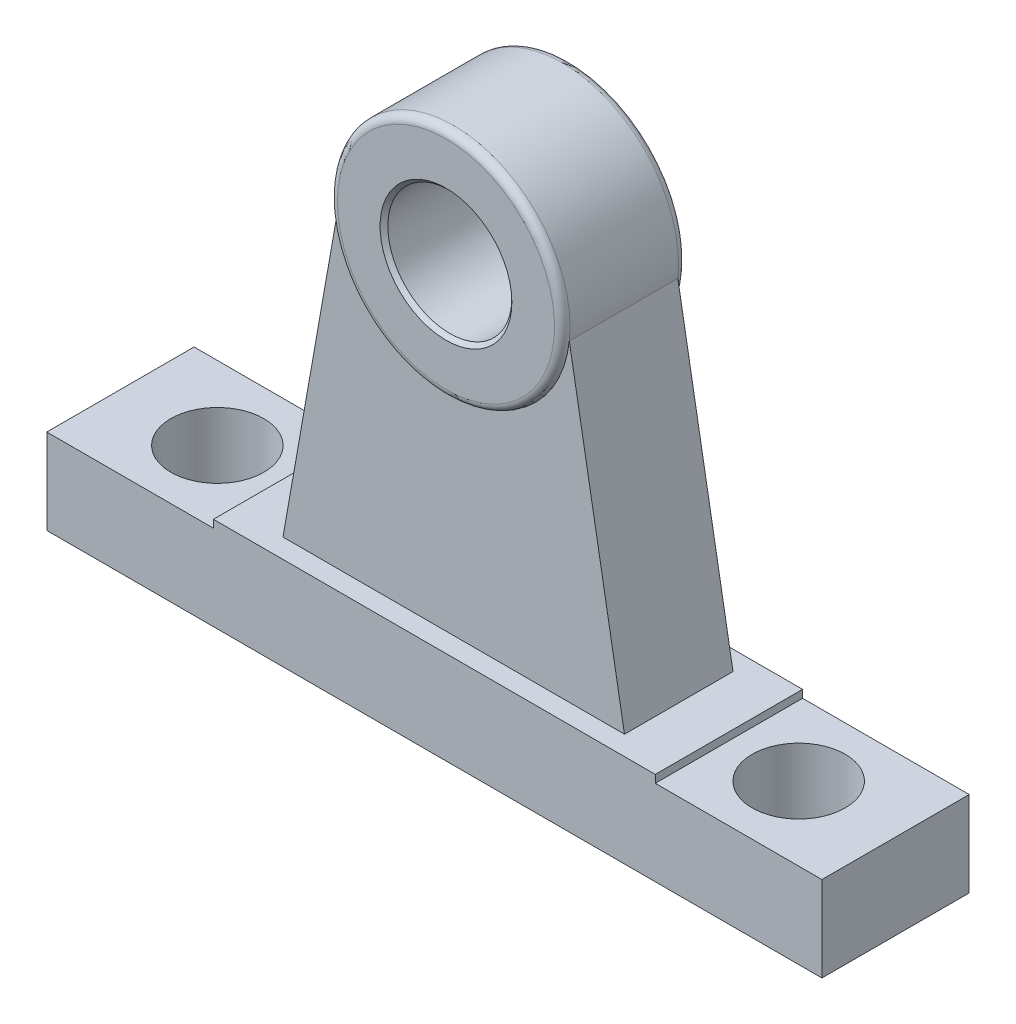
ISO-10303-21;
HEADER;
FILE_DESCRIPTION(('STEP AP214'),'2;1');
FILE_NAME('part.step','',(''),(''),'','','');
FILE_SCHEMA(('AUTOMOTIVE_DESIGN { 1 0 10303 214 1 1 1 1 }'));
ENDSEC;
DATA;
#1=APPLICATION_CONTEXT('core data for automotive mechanical design processes');
#2=APPLICATION_PROTOCOL_DEFINITION('international standard','automotive_design',2000,#1);
#3=PRODUCT_CONTEXT('',#1,'mechanical');
#4=PRODUCT('Part','Part','',(#3));
#5=PRODUCT_RELATED_PRODUCT_CATEGORY('part','',(#4));
#6=PRODUCT_DEFINITION_FORMATION('','',#4);
#7=PRODUCT_DEFINITION_CONTEXT('part definition',#1,'design');
#8=PRODUCT_DEFINITION('design','',#6,#7);
#9=PRODUCT_DEFINITION_SHAPE('','',#8);
#10=(LENGTH_UNIT() NAMED_UNIT(*) SI_UNIT(.MILLI.,.METRE.));
#11=(NAMED_UNIT(*) PLANE_ANGLE_UNIT() SI_UNIT($,.RADIAN.));
#12=(NAMED_UNIT(*) SI_UNIT($,.STERADIAN.) SOLID_ANGLE_UNIT());
#13=UNCERTAINTY_MEASURE_WITH_UNIT(LENGTH_MEASURE(1.E-05),#10,'distance_accuracy_value','');
#14=(GEOMETRIC_REPRESENTATION_CONTEXT(3) GLOBAL_UNCERTAINTY_ASSIGNED_CONTEXT((#13)) GLOBAL_UNIT_ASSIGNED_CONTEXT((#10,
#11,#12)) REPRESENTATION_CONTEXT('',''));
#15=CARTESIAN_POINT('',(0.,0.,0.));
#16=DIRECTION('',(0.,0.,1.));
#17=DIRECTION('',(1.,0.,0.));
#18=AXIS2_PLACEMENT_3D('',#15,#16,#17);
#19=CARTESIAN_POINT('',(0.,54.,-8.));
#20=DIRECTION('',(0.,0.,1.));
#21=DIRECTION('',(1.,0.,0.));
#22=AXIS2_PLACEMENT_3D('',#19,#20,#21);
#23=CYLINDRICAL_SURFACE('',#22,8.);
#24=CARTESIAN_POINT('',(0.,54.,7.5));
#25=DIRECTION('',(0.,0.,1.));
#26=DIRECTION('',(1.,0.,0.));
#27=AXIS2_PLACEMENT_3D('',#24,#25,#26);
#28=CIRCLE('',#27,8.);
#29=CARTESIAN_POINT('',(8.,54.,7.5));
#30=VERTEX_POINT('',#29);
#31=EDGE_CURVE('E483',#30,#30,#28,.T.);
#32=ORIENTED_EDGE('',*,*,#31,.T.);
#33=EDGE_LOOP('',(#32));
#34=FACE_BOUND('',#33,.T.);
#35=CARTESIAN_POINT('',(0.,54.,-7.5));
#36=DIRECTION('',(0.,0.,-1.));
#37=DIRECTION('',(-1.,0.,0.));
#38=AXIS2_PLACEMENT_3D('',#35,#36,#37);
#39=CIRCLE('',#38,8.);
#40=CARTESIAN_POINT('',(-8.,54.,-7.5));
#41=VERTEX_POINT('',#40);
#42=EDGE_CURVE('E502',#41,#41,#39,.T.);
#43=ORIENTED_EDGE('',*,*,#42,.T.);
#44=EDGE_LOOP('',(#43));
#45=FACE_BOUND('',#44,.T.);
#46=ADVANCED_FACE('F16',(#34,#45),#23,.F.);
#47=CARTESIAN_POINT('',(0.,54.,-8.));
#48=DIRECTION('',(0.,0.,-1.));
#49=DIRECTION('',(0.,1.,0.));
#50=AXIS2_PLACEMENT_3D('',#47,#48,#49);
#51=CONICAL_SURFACE('',#50,8.5,0.785398163397447);
#52=ORIENTED_EDGE('',*,*,#42,.F.);
#53=EDGE_LOOP('',(#52));
#54=FACE_BOUND('',#53,.T.);
#55=CARTESIAN_POINT('',(0.,54.,-8.));
#56=DIRECTION('',(0.,0.,-1.));
#57=DIRECTION('',(0.,1.,0.));
#58=AXIS2_PLACEMENT_3D('',#55,#56,#57);
#59=CIRCLE('',#58,8.5);
#60=CARTESIAN_POINT('',(0.,62.5,-8.));
#61=VERTEX_POINT('',#60);
#62=EDGE_CURVE('E19',#61,#61,#59,.T.);
#63=ORIENTED_EDGE('',*,*,#62,.T.);
#64=EDGE_LOOP('',(#63));
#65=FACE_BOUND('',#64,.T.);
#66=ADVANCED_FACE('F221',(#54,#65),#51,.F.);
#67=CARTESIAN_POINT('',(0.,54.,8.));
#68=DIRECTION('',(0.,0.,1.));
#69=DIRECTION('',(1.,0.,0.));
#70=AXIS2_PLACEMENT_3D('',#67,#68,#69);
#71=CONICAL_SURFACE('',#70,8.5,0.78539816339745);
#72=CARTESIAN_POINT('',(0.,54.,8.));
#73=DIRECTION('',(0.,0.,1.));
#74=DIRECTION('',(1.,0.,0.));
#75=AXIS2_PLACEMENT_3D('',#72,#73,#74);
#76=CIRCLE('',#75,8.5);
#77=CARTESIAN_POINT('',(8.5,54.,8.));
#78=VERTEX_POINT('',#77);
#79=EDGE_CURVE('E469',#78,#78,#76,.T.);
#80=ORIENTED_EDGE('',*,*,#79,.T.);
#81=EDGE_LOOP('',(#80));
#82=FACE_BOUND('',#81,.T.);
#83=ORIENTED_EDGE('',*,*,#31,.F.);
#84=EDGE_LOOP('',(#83));
#85=FACE_BOUND('',#84,.T.);
#86=ADVANCED_FACE('F218',(#82,#85),#71,.F.);
#87=CARTESIAN_POINT('',(-14.,54.,-8.));
#88=DIRECTION('',(0.,0.,1.));
#89=DIRECTION('',(1.,0.,0.));
#90=AXIS2_PLACEMENT_3D('',#87,#88,#89);
#91=PLANE('',#90);
#92=CARTESIAN_POINT('',(0.,54.,-8.));
#93=DIRECTION('',(0.,0.,1.));
#94=DIRECTION('',(-1.,0.,0.));
#95=AXIS2_PLACEMENT_3D('',#92,#93,#94);
#96=CIRCLE('',#95,14.);
#97=CARTESIAN_POINT('',(-14.,54.,-8.));
#98=VERTEX_POINT('',#97);
#99=EDGE_CURVE('E202',#98,#98,#96,.T.);
#100=ORIENTED_EDGE('',*,*,#99,.F.);
#101=EDGE_LOOP('',(#100));
#102=FACE_BOUND('',#101,.T.);
#103=ORIENTED_EDGE('',*,*,#62,.F.);
#104=EDGE_LOOP('',(#103));
#105=FACE_BOUND('',#104,.T.);
#106=ADVANCED_FACE('F208',(#102,#105),#91,.F.);
#107=CARTESIAN_POINT('',(0.,54.,8.));
#108=DIRECTION('',(0.,0.,-1.));
#109=DIRECTION('',(-1.,0.,0.));
#110=AXIS2_PLACEMENT_3D('',#107,#108,#109);
#111=PLANE('',#110);
#112=ORIENTED_EDGE('',*,*,#79,.F.);
#113=EDGE_LOOP('',(#112));
#114=FACE_BOUND('',#113,.T.);
#115=CARTESIAN_POINT('',(0.,54.,8.));
#116=DIRECTION('',(0.,0.,-1.));
#117=DIRECTION('',(-1.,0.,0.));
#118=AXIS2_PLACEMENT_3D('',#115,#116,#117);
#119=CIRCLE('',#118,14.);
#120=CARTESIAN_POINT('',(-14.,54.,8.));
#121=VERTEX_POINT('',#120);
#122=EDGE_CURVE('E132',#121,#121,#119,.T.);
#123=ORIENTED_EDGE('',*,*,#122,.F.);
#124=EDGE_LOOP('',(#123));
#125=FACE_BOUND('',#124,.T.);
#126=ADVANCED_FACE('F217',(#114,#125),#111,.F.);
#127=CARTESIAN_POINT('',(0.,54.,-7.));
#128=DIRECTION('',(0.,0.,-1.));
#129=DIRECTION('',(-1.,0.,0.));
#130=AXIS2_PLACEMENT_3D('',#127,#128,#129);
#131=TOROIDAL_SURFACE('',#130,14.,0.999999999999997);
#132=ORIENTED_EDGE('',*,*,#99,.T.);
#133=EDGE_LOOP('',(#132));
#134=FACE_BOUND('',#133,.T.);
#135=CARTESIAN_POINT('',(0.,54.,-7.));
#136=DIRECTION('',(0.,0.,-1.));
#137=DIRECTION('',(-1.,0.,0.));
#138=AXIS2_PLACEMENT_3D('',#135,#136,#137);
#139=CIRCLE('',#138,15.);
#140=CARTESIAN_POINT('',(14.9105539895769,52.3643411957526,-7.00000000000001));
#141=VERTEX_POINT('',#140);
#142=CARTESIAN_POINT('',(-14.9105539895769,52.3643411957525,-7.));
#143=VERTEX_POINT('',#142);
#144=EDGE_CURVE('E104',#141,#143,#139,.T.);
#145=ORIENTED_EDGE('',*,*,#144,.T.);
#146=CARTESIAN_POINT('',(0.,54.,-7.));
#147=DIRECTION('',(0.,0.,1.));
#148=DIRECTION('',(1.,0.,0.));
#149=AXIS2_PLACEMENT_3D('',#146,#147,#148);
#150=CIRCLE('',#149,15.);
#151=EDGE_CURVE('E128',#141,#143,#150,.T.);
#152=ORIENTED_EDGE('',*,*,#151,.F.);
#153=EDGE_LOOP('',(#145,#152));
#154=FACE_BOUND('',#153,.T.);
#155=ADVANCED_FACE('F129',(#134,#154),#131,.T.);
#156=CARTESIAN_POINT('',(0.,54.,7.));
#157=DIRECTION('',(0.,0.,-1.));
#158=DIRECTION('',(-1.,0.,0.));
#159=AXIS2_PLACEMENT_3D('',#156,#157,#158);
#160=TOROIDAL_SURFACE('',#159,14.,0.999999999999997);
#161=CARTESIAN_POINT('',(0.,54.,7.));
#162=DIRECTION('',(0.,0.,-1.));
#163=DIRECTION('',(-1.,0.,0.));
#164=AXIS2_PLACEMENT_3D('',#161,#162,#163);
#165=CIRCLE('',#164,15.);
#166=CARTESIAN_POINT('',(14.9105539895769,52.3643411957526,7.));
#167=VERTEX_POINT('',#166);
#168=CARTESIAN_POINT('',(-14.9105539895769,52.3643411957525,7.));
#169=VERTEX_POINT('',#168);
#170=EDGE_CURVE('E167',#167,#169,#165,.T.);
#171=ORIENTED_EDGE('',*,*,#170,.F.);
#172=CARTESIAN_POINT('',(0.,54.,7.));
#173=DIRECTION('',(0.,0.,1.));
#174=DIRECTION('',(1.,0.,0.));
#175=AXIS2_PLACEMENT_3D('',#172,#173,#174);
#176=CIRCLE('',#175,15.);
#177=EDGE_CURVE('E114',#169,#167,#176,.F.);
#178=ORIENTED_EDGE('',*,*,#177,.F.);
#179=EDGE_LOOP('',(#171,#178));
#180=FACE_BOUND('',#179,.T.);
#181=ORIENTED_EDGE('',*,*,#122,.T.);
#182=EDGE_LOOP('',(#181));
#183=FACE_BOUND('',#182,.T.);
#184=ADVANCED_FACE('F176',(#180,#183),#160,.T.);
#185=CARTESIAN_POINT('',(0.,54.,-8.));
#186=DIRECTION('',(0.,0.,1.));
#187=DIRECTION('',(1.,0.,0.));
#188=AXIS2_PLACEMENT_3D('',#185,#186,#187);
#189=CYLINDRICAL_SURFACE('',#188,15.);
#190=ORIENTED_EDGE('',*,*,#177,.T.);
#191=DIRECTION('',(0.,0.,1.));
#192=VECTOR('',#191,1.);
#193=CARTESIAN_POINT('',(14.910553989577,52.3643411957525,7.));
#194=LINE('',#193,#192);
#195=EDGE_CURVE('E120',#167,#141,#194,.F.);
#196=ORIENTED_EDGE('',*,*,#195,.T.);
#197=ORIENTED_EDGE('',*,*,#151,.T.);
#198=DIRECTION('',(0.,0.,1.));
#199=VECTOR('',#198,1.);
#200=CARTESIAN_POINT('',(-14.9105539895769,52.3643411957525,7.));
#201=LINE('',#200,#199);
#202=EDGE_CURVE('E165',#143,#169,#201,.T.);
#203=ORIENTED_EDGE('',*,*,#202,.T.);
#204=EDGE_LOOP('',(#190,#196,#197,#203));
#205=FACE_BOUND('',#204,.T.);
#206=ADVANCED_FACE('F134',(#205),#189,.T.);
#207=CARTESIAN_POINT('',(0.,54.0000000000001,-7.));
#208=DIRECTION('',(0.,0.,1.));
#209=DIRECTION('',(1.,0.,0.));
#210=AXIS2_PLACEMENT_3D('',#207,#208,#209);
#211=PLANE('',#210);
#212=ORIENTED_EDGE('',*,*,#144,.F.);
#213=DIRECTION('',(0.17364817766693,-0.984807753012208,0.));
#214=VECTOR('',#213,1.);
#215=CARTESIAN_POINT('',(22.0278764009103,12.,-7.00000000000001));
#216=LINE('',#215,#214);
#217=CARTESIAN_POINT('',(22.0278764009103,12.,-7.));
#218=VERTEX_POINT('',#217);
#219=EDGE_CURVE('E108',#141,#218,#216,.T.);
#220=ORIENTED_EDGE('',*,*,#219,.T.);
#221=DIRECTION('',(1.,0.,0.));
#222=VECTOR('',#221,1.);
#223=CARTESIAN_POINT('',(28.5,12.,-7.));
#224=LINE('',#223,#222);
#225=CARTESIAN_POINT('',(-22.0278764009103,12.,-7.));
#226=VERTEX_POINT('',#225);
#227=EDGE_CURVE('E160',#218,#226,#224,.F.);
#228=ORIENTED_EDGE('',*,*,#227,.T.);
#229=DIRECTION('',(0.17364817766693,0.984807753012208,0.));
#230=VECTOR('',#229,1.);
#231=CARTESIAN_POINT('',(-14.1812316433758,56.5005337584038,-7.00000000000001));
#232=LINE('',#231,#230);
#233=EDGE_CURVE('E110',#226,#143,#232,.T.);
#234=ORIENTED_EDGE('',*,*,#233,.T.);
#235=EDGE_LOOP('',(#212,#220,#228,#234));
#236=FACE_BOUND('',#235,.T.);
#237=ADVANCED_FACE('F106',(#236),#211,.F.);
#238=CARTESIAN_POINT('',(-14.1812316433758,56.5005337584038,7.));
#239=DIRECTION('',(0.984807753012208,-0.17364817766693,0.));
#240=DIRECTION('',(0.17364817766693,0.984807753012208,0.));
#241=AXIS2_PLACEMENT_3D('',#238,#239,#240);
#242=PLANE('',#241);
#243=ORIENTED_EDGE('',*,*,#233,.F.);
#244=DIRECTION('',(0.,0.,-1.));
#245=VECTOR('',#244,1.);
#246=CARTESIAN_POINT('',(-22.0278764009103,12.,-9.5));
#247=LINE('',#246,#245);
#248=CARTESIAN_POINT('',(-22.0278764009102,12.,7.));
#249=VERTEX_POINT('',#248);
#250=EDGE_CURVE('E155',#226,#249,#247,.F.);
#251=ORIENTED_EDGE('',*,*,#250,.T.);
#252=DIRECTION('',(-0.173648177666929,-0.984807753012208,0.));
#253=VECTOR('',#252,1.);
#254=CARTESIAN_POINT('',(-14.9105539895769,52.3643411957525,7.));
#255=LINE('',#254,#253);
#256=EDGE_CURVE('E125',#169,#249,#255,.T.);
#257=ORIENTED_EDGE('',*,*,#256,.F.);
#258=ORIENTED_EDGE('',*,*,#202,.F.);
#259=EDGE_LOOP('',(#243,#251,#257,#258));
#260=FACE_BOUND('',#259,.T.);
#261=ADVANCED_FACE('F297',(#260),#242,.F.);
#262=CARTESIAN_POINT('',(0.,54.0000000000001,7.));
#263=DIRECTION('',(0.,0.,1.));
#264=DIRECTION('',(1.,0.,0.));
#265=AXIS2_PLACEMENT_3D('',#262,#263,#264);
#266=PLANE('',#265);
#267=ORIENTED_EDGE('',*,*,#256,.T.);
#268=DIRECTION('',(1.,0.,0.));
#269=VECTOR('',#268,1.);
#270=CARTESIAN_POINT('',(28.5,12.,7.));
#271=LINE('',#270,#269);
#272=CARTESIAN_POINT('',(22.0278764009103,12.,7.));
#273=VERTEX_POINT('',#272);
#274=EDGE_CURVE('E150',#249,#273,#271,.T.);
#275=ORIENTED_EDGE('',*,*,#274,.T.);
#276=DIRECTION('',(0.17364817766693,-0.984807753012208,0.));
#277=VECTOR('',#276,1.);
#278=CARTESIAN_POINT('',(22.0278764009103,12.,7.));
#279=LINE('',#278,#277);
#280=EDGE_CURVE('E124',#273,#167,#279,.F.);
#281=ORIENTED_EDGE('',*,*,#280,.T.);
#282=ORIENTED_EDGE('',*,*,#170,.T.);
#283=EDGE_LOOP('',(#267,#275,#281,#282));
#284=FACE_BOUND('',#283,.T.);
#285=ADVANCED_FACE('F294',(#284),#266,.T.);
#286=CARTESIAN_POINT('',(22.0278764009103,12.,7.));
#287=DIRECTION('',(-0.984807753012208,-0.17364817766693,0.));
#288=DIRECTION('',(0.17364817766693,-0.984807753012208,0.));
#289=AXIS2_PLACEMENT_3D('',#286,#287,#288);
#290=PLANE('',#289);
#291=ORIENTED_EDGE('',*,*,#280,.F.);
#292=DIRECTION('',(0.,0.,-1.));
#293=VECTOR('',#292,1.);
#294=CARTESIAN_POINT('',(22.0278764009103,12.,-9.5));
#295=LINE('',#294,#293);
#296=EDGE_CURVE('E123',#273,#218,#295,.T.);
#297=ORIENTED_EDGE('',*,*,#296,.T.);
#298=ORIENTED_EDGE('',*,*,#219,.F.);
#299=ORIENTED_EDGE('',*,*,#195,.F.);
#300=EDGE_LOOP('',(#291,#297,#298,#299));
#301=FACE_BOUND('',#300,.T.);
#302=ADVANCED_FACE('F118',(#301),#290,.F.);
#303=CARTESIAN_POINT('',(-28.5,0.,0.));
#304=DIRECTION('',(1.,0.,0.));
#305=DIRECTION('',(0.,0.,-1.));
#306=AXIS2_PLACEMENT_3D('',#303,#304,#305);
#307=PLANE('',#306);
#308=DIRECTION('',(0.,1.,0.));
#309=VECTOR('',#308,1.);
#310=CARTESIAN_POINT('',(-28.5,0.,9.5));
#311=LINE('',#310,#309);
#312=CARTESIAN_POINT('',(-28.5,12.,9.5));
#313=VERTEX_POINT('',#312);
#314=CARTESIAN_POINT('',(-28.5,11.,9.5));
#315=VERTEX_POINT('',#314);
#316=EDGE_CURVE('E138',#313,#315,#311,.F.);
#317=ORIENTED_EDGE('',*,*,#316,.F.);
#318=DIRECTION('',(0.,0.,-1.));
#319=VECTOR('',#318,1.);
#320=CARTESIAN_POINT('',(-28.5,12.,-9.5));
#321=LINE('',#320,#319);
#322=CARTESIAN_POINT('',(-28.5,12.,-9.5));
#323=VERTEX_POINT('',#322);
#324=EDGE_CURVE('E566',#313,#323,#321,.T.);
#325=ORIENTED_EDGE('',*,*,#324,.T.);
#326=DIRECTION('',(0.,1.,0.));
#327=VECTOR('',#326,1.);
#328=CARTESIAN_POINT('',(-28.5,0.,-9.5));
#329=LINE('',#328,#327);
#330=CARTESIAN_POINT('',(-28.5,11.,-9.5));
#331=VERTEX_POINT('',#330);
#332=EDGE_CURVE('E136',#331,#323,#329,.T.);
#333=ORIENTED_EDGE('',*,*,#332,.F.);
#334=DIRECTION('',(0.,0.,1.));
#335=VECTOR('',#334,1.);
#336=CARTESIAN_POINT('',(-28.5,11.,0.));
#337=LINE('',#336,#335);
#338=EDGE_CURVE('E162',#315,#331,#337,.F.);
#339=ORIENTED_EDGE('',*,*,#338,.F.);
#340=EDGE_LOOP('',(#317,#325,#333,#339));
#341=FACE_BOUND('',#340,.T.);
#342=ADVANCED_FACE('F287',(#341),#307,.F.);
#343=CARTESIAN_POINT('',(28.5,0.,0.));
#344=DIRECTION('',(1.,0.,0.));
#345=DIRECTION('',(0.,0.,-1.));
#346=AXIS2_PLACEMENT_3D('',#343,#344,#345);
#347=PLANE('',#346);
#348=DIRECTION('',(0.,1.,0.));
#349=VECTOR('',#348,1.);
#350=CARTESIAN_POINT('',(28.5,0.,-9.5));
#351=LINE('',#350,#349);
#352=CARTESIAN_POINT('',(28.5,11.,-9.5));
#353=VERTEX_POINT('',#352);
#354=CARTESIAN_POINT('',(28.5,12.,-9.5));
#355=VERTEX_POINT('',#354);
#356=EDGE_CURVE('E573',#353,#355,#351,.T.);
#357=ORIENTED_EDGE('',*,*,#356,.T.);
#358=DIRECTION('',(0.,0.,-1.));
#359=VECTOR('',#358,1.);
#360=CARTESIAN_POINT('',(28.5,12.,-9.5));
#361=LINE('',#360,#359);
#362=CARTESIAN_POINT('',(28.5,12.,9.5));
#363=VERTEX_POINT('',#362);
#364=EDGE_CURVE('E149',#355,#363,#361,.F.);
#365=ORIENTED_EDGE('',*,*,#364,.T.);
#366=DIRECTION('',(0.,1.,0.));
#367=VECTOR('',#366,1.);
#368=CARTESIAN_POINT('',(28.5,0.,9.5));
#369=LINE('',#368,#367);
#370=CARTESIAN_POINT('',(28.5,11.,9.5));
#371=VERTEX_POINT('',#370);
#372=EDGE_CURVE('E575',#363,#371,#369,.F.);
#373=ORIENTED_EDGE('',*,*,#372,.T.);
#374=DIRECTION('',(0.,0.,1.));
#375=VECTOR('',#374,1.);
#376=CARTESIAN_POINT('',(28.5,11.,0.));
#377=LINE('',#376,#375);
#378=EDGE_CURVE('E491',#353,#371,#377,.T.);
#379=ORIENTED_EDGE('',*,*,#378,.F.);
#380=EDGE_LOOP('',(#357,#365,#373,#379));
#381=FACE_BOUND('',#380,.T.);
#382=ADVANCED_FACE('F283',(#381),#347,.T.);
#383=CARTESIAN_POINT('',(37.5,11.,0.));
#384=DIRECTION('',(0.,-1.,0.));
#385=DIRECTION('',(0.,0.,-1.));
#386=AXIS2_PLACEMENT_3D('',#383,#384,#385);
#387=CYLINDRICAL_SURFACE('',#386,6.);
#388=CARTESIAN_POINT('',(37.5,0.50000000004502,0.));
#389=DIRECTION('',(0.,-1.,0.));
#390=DIRECTION('',(0.,0.,-1.));
#391=AXIS2_PLACEMENT_3D('',#388,#389,#390);
#392=CIRCLE('',#391,5.99999999997181);
#393=CARTESIAN_POINT('',(37.5,0.50000000004502,-5.99999999997181));
#394=VERTEX_POINT('',#393);
#395=EDGE_CURVE('E494',#394,#394,#392,.T.);
#396=ORIENTED_EDGE('',*,*,#395,.T.);
#397=EDGE_LOOP('',(#396));
#398=FACE_BOUND('',#397,.T.);
#399=CARTESIAN_POINT('',(37.5,11.,0.));
#400=DIRECTION('',(0.,-1.,0.));
#401=DIRECTION('',(0.,0.,-1.));
#402=AXIS2_PLACEMENT_3D('',#399,#400,#401);
#403=CIRCLE('',#402,6.);
#404=CARTESIAN_POINT('',(37.5,11.,-6.));
#405=VERTEX_POINT('',#404);
#406=EDGE_CURVE('E487',#405,#405,#403,.T.);
#407=ORIENTED_EDGE('',*,*,#406,.F.);
#408=EDGE_LOOP('',(#407));
#409=FACE_BOUND('',#408,.T.);
#410=ADVANCED_FACE('F279',(#398,#409),#387,.F.);
#411=CARTESIAN_POINT('',(0.,11.,0.));
#412=DIRECTION('',(0.,1.,0.));
#413=DIRECTION('',(0.,0.,1.));
#414=AXIS2_PLACEMENT_3D('',#411,#412,#413);
#415=PLANE('',#414);
#416=CARTESIAN_POINT('',(-37.5,11.,0.));
#417=DIRECTION('',(0.,-1.,0.));
#418=DIRECTION('',(0.,0.,-1.));
#419=AXIS2_PLACEMENT_3D('',#416,#417,#418);
#420=CIRCLE('',#419,6.00000000000001);
#421=CARTESIAN_POINT('',(-37.5,11.,-6.00000000000001));
#422=VERTEX_POINT('',#421);
#423=EDGE_CURVE('E490',#422,#422,#420,.T.);
#424=ORIENTED_EDGE('',*,*,#423,.T.);
#425=EDGE_LOOP('',(#424));
#426=FACE_BOUND('',#425,.T.);
#427=DIRECTION('',(1.,0.,0.));
#428=VECTOR('',#427,1.);
#429=CARTESIAN_POINT('',(50.,11.,-9.5));
#430=LINE('',#429,#428);
#431=CARTESIAN_POINT('',(-50.,11.,-9.5));
#432=VERTEX_POINT('',#431);
#433=EDGE_CURVE('E552',#331,#432,#430,.F.);
#434=ORIENTED_EDGE('',*,*,#433,.T.);
#435=DIRECTION('',(0.,0.,-1.));
#436=VECTOR('',#435,1.);
#437=CARTESIAN_POINT('',(-50.,11.,-9.5));
#438=LINE('',#437,#436);
#439=CARTESIAN_POINT('',(-50.,11.,9.5));
#440=VERTEX_POINT('',#439);
#441=EDGE_CURVE('E547',#432,#440,#438,.F.);
#442=ORIENTED_EDGE('',*,*,#441,.T.);
#443=DIRECTION('',(-1.,0.,0.));
#444=VECTOR('',#443,1.);
#445=CARTESIAN_POINT('',(-50.,11.,9.5));
#446=LINE('',#445,#444);
#447=EDGE_CURVE('E541',#440,#315,#446,.F.);
#448=ORIENTED_EDGE('',*,*,#447,.T.);
#449=ORIENTED_EDGE('',*,*,#338,.T.);
#450=EDGE_LOOP('',(#434,#442,#448,#449));
#451=FACE_BOUND('',#450,.T.);
#452=ADVANCED_FACE('F275',(#426,#451),#415,.T.);
#453=CARTESIAN_POINT('',(28.5,12.,-9.5));
#454=DIRECTION('',(0.,-1.,0.));
#455=DIRECTION('',(0.,0.,-1.));
#456=AXIS2_PLACEMENT_3D('',#453,#454,#455);
#457=PLANE('',#456);
#458=DIRECTION('',(-1.,0.,0.));
#459=VECTOR('',#458,1.);
#460=CARTESIAN_POINT('',(-50.,12.,9.5));
#461=LINE('',#460,#459);
#462=EDGE_CURVE('E538',#313,#363,#461,.F.);
#463=ORIENTED_EDGE('',*,*,#462,.T.);
#464=ORIENTED_EDGE('',*,*,#364,.F.);
#465=DIRECTION('',(1.,0.,0.));
#466=VECTOR('',#465,1.);
#467=CARTESIAN_POINT('',(50.,12.,-9.5));
#468=LINE('',#467,#466);
#469=EDGE_CURVE('E554',#355,#323,#468,.F.);
#470=ORIENTED_EDGE('',*,*,#469,.T.);
#471=ORIENTED_EDGE('',*,*,#324,.F.);
#472=EDGE_LOOP('',(#463,#464,#470,#471));
#473=FACE_BOUND('',#472,.T.);
#474=ORIENTED_EDGE('',*,*,#274,.F.);
#475=ORIENTED_EDGE('',*,*,#250,.F.);
#476=ORIENTED_EDGE('',*,*,#227,.F.);
#477=ORIENTED_EDGE('',*,*,#296,.F.);
#478=EDGE_LOOP('',(#474,#475,#476,#477));
#479=FACE_BOUND('',#478,.T.);
#480=ADVANCED_FACE('F271',(#473,#479),#457,.F.);
#481=CARTESIAN_POINT('',(0.,11.,0.));
#482=DIRECTION('',(0.,1.,0.));
#483=DIRECTION('',(0.,0.,1.));
#484=AXIS2_PLACEMENT_3D('',#481,#482,#483);
#485=PLANE('',#484);
#486=ORIENTED_EDGE('',*,*,#406,.T.);
#487=EDGE_LOOP('',(#486));
#488=FACE_BOUND('',#487,.T.);
#489=DIRECTION('',(0.,0.,1.));
#490=VECTOR('',#489,1.);
#491=CARTESIAN_POINT('',(50.,11.,9.5));
#492=LINE('',#491,#490);
#493=CARTESIAN_POINT('',(50.,11.,9.5));
#494=VERTEX_POINT('',#493);
#495=CARTESIAN_POINT('',(50.,11.,-9.5));
#496=VERTEX_POINT('',#495);
#497=EDGE_CURVE('E527',#494,#496,#492,.F.);
#498=ORIENTED_EDGE('',*,*,#497,.T.);
#499=DIRECTION('',(1.,0.,0.));
#500=VECTOR('',#499,1.);
#501=CARTESIAN_POINT('',(50.,11.,-9.5));
#502=LINE('',#501,#500);
#503=EDGE_CURVE('E557',#496,#353,#502,.F.);
#504=ORIENTED_EDGE('',*,*,#503,.T.);
#505=ORIENTED_EDGE('',*,*,#378,.T.);
#506=DIRECTION('',(-1.,0.,0.));
#507=VECTOR('',#506,1.);
#508=CARTESIAN_POINT('',(-50.,11.,9.5));
#509=LINE('',#508,#507);
#510=EDGE_CURVE('E536',#371,#494,#509,.F.);
#511=ORIENTED_EDGE('',*,*,#510,.T.);
#512=EDGE_LOOP('',(#498,#504,#505,#511));
#513=FACE_BOUND('',#512,.T.);
#514=ADVANCED_FACE('F267',(#488,#513),#485,.T.);
#515=CARTESIAN_POINT('',(-37.5,11.,0.));
#516=DIRECTION('',(0.,-1.,0.));
#517=DIRECTION('',(0.,0.,-1.));
#518=AXIS2_PLACEMENT_3D('',#515,#516,#517);
#519=CYLINDRICAL_SURFACE('',#518,6.00000000000001);
#520=CARTESIAN_POINT('',(-37.5,0.499999999931333,0.));
#521=DIRECTION('',(0.,-1.,0.));
#522=DIRECTION('',(0.,0.,-1.));
#523=AXIS2_PLACEMENT_3D('',#520,#521,#522);
#524=CIRCLE('',#523,6.00000000002865);
#525=CARTESIAN_POINT('',(-37.5,0.499999999931333,-6.00000000002865));
#526=VERTEX_POINT('',#525);
#527=EDGE_CURVE('E498',#526,#526,#524,.T.);
#528=ORIENTED_EDGE('',*,*,#527,.T.);
#529=EDGE_LOOP('',(#528));
#530=FACE_BOUND('',#529,.T.);
#531=ORIENTED_EDGE('',*,*,#423,.F.);
#532=EDGE_LOOP('',(#531));
#533=FACE_BOUND('',#532,.T.);
#534=ADVANCED_FACE('F263',(#530,#533),#519,.F.);
#535=CARTESIAN_POINT('',(37.5,5.6843418860808E-11,0.));
#536=DIRECTION('',(0.,-1.,0.));
#537=DIRECTION('',(0.,0.,-1.));
#538=AXIS2_PLACEMENT_3D('',#535,#536,#537);
#539=CONICAL_SURFACE('',#538,6.49999999995998,0.785398163397448);
#540=CARTESIAN_POINT('',(37.5,5.6843418860808E-11,0.));
#541=DIRECTION('',(0.,-1.,0.));
#542=DIRECTION('',(0.,0.,-1.));
#543=AXIS2_PLACEMENT_3D('',#540,#541,#542);
#544=CIRCLE('',#543,6.49999999995998);
#545=CARTESIAN_POINT('',(37.5,5.6843418860808E-11,-6.49999999995998));
#546=VERTEX_POINT('',#545);
#547=EDGE_CURVE('E495',#546,#546,#544,.T.);
#548=ORIENTED_EDGE('',*,*,#547,.T.);
#549=EDGE_LOOP('',(#548));
#550=FACE_BOUND('',#549,.T.);
#551=ORIENTED_EDGE('',*,*,#395,.F.);
#552=EDGE_LOOP('',(#551));
#553=FACE_BOUND('',#552,.T.);
#554=ADVANCED_FACE('F259',(#550,#553),#539,.F.);
#555=CARTESIAN_POINT('',(50.,11.,-9.5));
#556=DIRECTION('',(0.,0.,1.));
#557=DIRECTION('',(1.,0.,0.));
#558=AXIS2_PLACEMENT_3D('',#555,#556,#557);
#559=PLANE('',#558);
#560=DIRECTION('',(0.,1.,0.));
#561=VECTOR('',#560,1.);
#562=CARTESIAN_POINT('',(-50.,11.,-9.5));
#563=LINE('',#562,#561);
#564=CARTESIAN_POINT('',(-50.,0.,-9.5));
#565=VERTEX_POINT('',#564);
#566=EDGE_CURVE('E549',#565,#432,#563,.T.);
#567=ORIENTED_EDGE('',*,*,#566,.T.);
#568=ORIENTED_EDGE('',*,*,#433,.F.);
#569=ORIENTED_EDGE('',*,*,#332,.T.);
#570=ORIENTED_EDGE('',*,*,#469,.F.);
#571=ORIENTED_EDGE('',*,*,#356,.F.);
#572=ORIENTED_EDGE('',*,*,#503,.F.);
#573=DIRECTION('',(0.,1.,0.));
#574=VECTOR('',#573,1.);
#575=CARTESIAN_POINT('',(50.,11.,-9.5));
#576=LINE('',#575,#574);
#577=CARTESIAN_POINT('',(50.,0.,-9.5));
#578=VERTEX_POINT('',#577);
#579=EDGE_CURVE('E523',#496,#578,#576,.F.);
#580=ORIENTED_EDGE('',*,*,#579,.T.);
#581=DIRECTION('',(1.,0.,0.));
#582=VECTOR('',#581,1.);
#583=CARTESIAN_POINT('',(0.,0.,-9.5));
#584=LINE('',#583,#582);
#585=EDGE_CURVE('E497',#578,#565,#584,.F.);
#586=ORIENTED_EDGE('',*,*,#585,.T.);
#587=EDGE_LOOP('',(#567,#568,#569,#570,#571,#572,#580,#586));
#588=FACE_BOUND('',#587,.T.);
#589=ADVANCED_FACE('F255',(#588),#559,.F.);
#590=CARTESIAN_POINT('',(-50.,11.,-9.5));
#591=DIRECTION('',(1.,0.,0.));
#592=DIRECTION('',(0.,0.,-1.));
#593=AXIS2_PLACEMENT_3D('',#590,#591,#592);
#594=PLANE('',#593);
#595=DIRECTION('',(0.,1.,0.));
#596=VECTOR('',#595,1.);
#597=CARTESIAN_POINT('',(-50.,11.,9.5));
#598=LINE('',#597,#596);
#599=CARTESIAN_POINT('',(-50.,0.,9.5));
#600=VERTEX_POINT('',#599);
#601=EDGE_CURVE('E544',#600,#440,#598,.T.);
#602=ORIENTED_EDGE('',*,*,#601,.T.);
#603=ORIENTED_EDGE('',*,*,#441,.F.);
#604=ORIENTED_EDGE('',*,*,#566,.F.);
#605=DIRECTION('',(0.,0.,1.));
#606=VECTOR('',#605,1.);
#607=CARTESIAN_POINT('',(-50.,0.,0.));
#608=LINE('',#607,#606);
#609=EDGE_CURVE('E520',#565,#600,#608,.T.);
#610=ORIENTED_EDGE('',*,*,#609,.T.);
#611=EDGE_LOOP('',(#602,#603,#604,#610));
#612=FACE_BOUND('',#611,.T.);
#613=ADVANCED_FACE('F251',(#612),#594,.F.);
#614=CARTESIAN_POINT('',(-50.,11.,9.5));
#615=DIRECTION('',(0.,0.,-1.));
#616=DIRECTION('',(-1.,0.,0.));
#617=AXIS2_PLACEMENT_3D('',#614,#615,#616);
#618=PLANE('',#617);
#619=ORIENTED_EDGE('',*,*,#372,.F.);
#620=ORIENTED_EDGE('',*,*,#462,.F.);
#621=ORIENTED_EDGE('',*,*,#316,.T.);
#622=ORIENTED_EDGE('',*,*,#447,.F.);
#623=ORIENTED_EDGE('',*,*,#601,.F.);
#624=DIRECTION('',(1.,0.,0.));
#625=VECTOR('',#624,1.);
#626=CARTESIAN_POINT('',(0.,0.,9.5));
#627=LINE('',#626,#625);
#628=CARTESIAN_POINT('',(50.,0.,9.5));
#629=VERTEX_POINT('',#628);
#630=EDGE_CURVE('E594',#600,#629,#627,.T.);
#631=ORIENTED_EDGE('',*,*,#630,.T.);
#632=DIRECTION('',(0.,1.,0.));
#633=VECTOR('',#632,1.);
#634=CARTESIAN_POINT('',(50.,11.,9.5));
#635=LINE('',#634,#633);
#636=EDGE_CURVE('E34',#629,#494,#635,.T.);
#637=ORIENTED_EDGE('',*,*,#636,.T.);
#638=ORIENTED_EDGE('',*,*,#510,.F.);
#639=EDGE_LOOP('',(#619,#620,#621,#622,#623,#631,#637,#638));
#640=FACE_BOUND('',#639,.T.);
#641=ADVANCED_FACE('F248',(#640),#618,.F.);
#642=CARTESIAN_POINT('',(50.,11.,9.5));
#643=DIRECTION('',(-1.,0.,0.));
#644=DIRECTION('',(0.,0.,1.));
#645=AXIS2_PLACEMENT_3D('',#642,#643,#644);
#646=PLANE('',#645);
#647=ORIENTED_EDGE('',*,*,#579,.F.);
#648=ORIENTED_EDGE('',*,*,#497,.F.);
#649=ORIENTED_EDGE('',*,*,#636,.F.);
#650=DIRECTION('',(0.,0.,1.));
#651=VECTOR('',#650,1.);
#652=CARTESIAN_POINT('',(50.,0.,0.));
#653=LINE('',#652,#651);
#654=EDGE_CURVE('E25',#629,#578,#653,.F.);
#655=ORIENTED_EDGE('',*,*,#654,.T.);
#656=EDGE_LOOP('',(#647,#648,#649,#655));
#657=FACE_BOUND('',#656,.T.);
#658=ADVANCED_FACE('F240',(#657),#646,.F.);
#659=CARTESIAN_POINT('',(-37.5,1.13686837721616E-10,0.));
#660=DIRECTION('',(0.,-1.,0.));
#661=DIRECTION('',(0.,0.,-1.));
#662=AXIS2_PLACEMENT_3D('',#659,#660,#661);
#663=CONICAL_SURFACE('',#662,6.49999999990314,0.785398163454292);
#664=CARTESIAN_POINT('',(-37.5,5.68434188672704E-11,0.));
#665=DIRECTION('',(0.,-1.,0.));
#666=DIRECTION('',(0.,0.,-1.));
#667=AXIS2_PLACEMENT_3D('',#664,#665,#666);
#668=CIRCLE('',#667,6.49999999995998);
#669=CARTESIAN_POINT('',(-37.5,5.68434188672704E-11,-6.49999999995998));
#670=VERTEX_POINT('',#669);
#671=EDGE_CURVE('E10',#670,#670,#668,.T.);
#672=ORIENTED_EDGE('',*,*,#671,.T.);
#673=EDGE_LOOP('',(#672));
#674=FACE_BOUND('',#673,.T.);
#675=ORIENTED_EDGE('',*,*,#527,.F.);
#676=EDGE_LOOP('',(#675));
#677=FACE_BOUND('',#676,.T.);
#678=ADVANCED_FACE('F234',(#674,#677),#663,.F.);
#679=CARTESIAN_POINT('',(0.,0.,0.));
#680=DIRECTION('',(0.,1.,0.));
#681=DIRECTION('',(0.,0.,1.));
#682=AXIS2_PLACEMENT_3D('',#679,#680,#681);
#683=PLANE('',#682);
#684=ORIENTED_EDGE('',*,*,#671,.F.);
#685=EDGE_LOOP('',(#684));
#686=FACE_BOUND('',#685,.T.);
#687=ORIENTED_EDGE('',*,*,#630,.F.);
#688=ORIENTED_EDGE('',*,*,#609,.F.);
#689=ORIENTED_EDGE('',*,*,#585,.F.);
#690=ORIENTED_EDGE('',*,*,#654,.F.);
#691=EDGE_LOOP('',(#687,#688,#689,#690));
#692=FACE_BOUND('',#691,.T.);
#693=ORIENTED_EDGE('',*,*,#547,.F.);
#694=EDGE_LOOP('',(#693));
#695=FACE_BOUND('',#694,.T.);
#696=ADVANCED_FACE('F232',(#686,#692,#695),#683,.F.);
#697=CLOSED_SHELL('',(#46,#66,#86,#106,#126,#155,#184,#206,#237,#261,#285,#302,#342,#382,#410,
#452,#480,#514,#534,#554,#589,#613,#641,#658,#678,#696));
#698=MANIFOLD_SOLID_BREP('B1',#697);
#699=ADVANCED_BREP_SHAPE_REPRESENTATION('',(#18,#698),#14);
#700=SHAPE_DEFINITION_REPRESENTATION(#9,#699);
ENDSEC;
END-ISO-10303-21;
